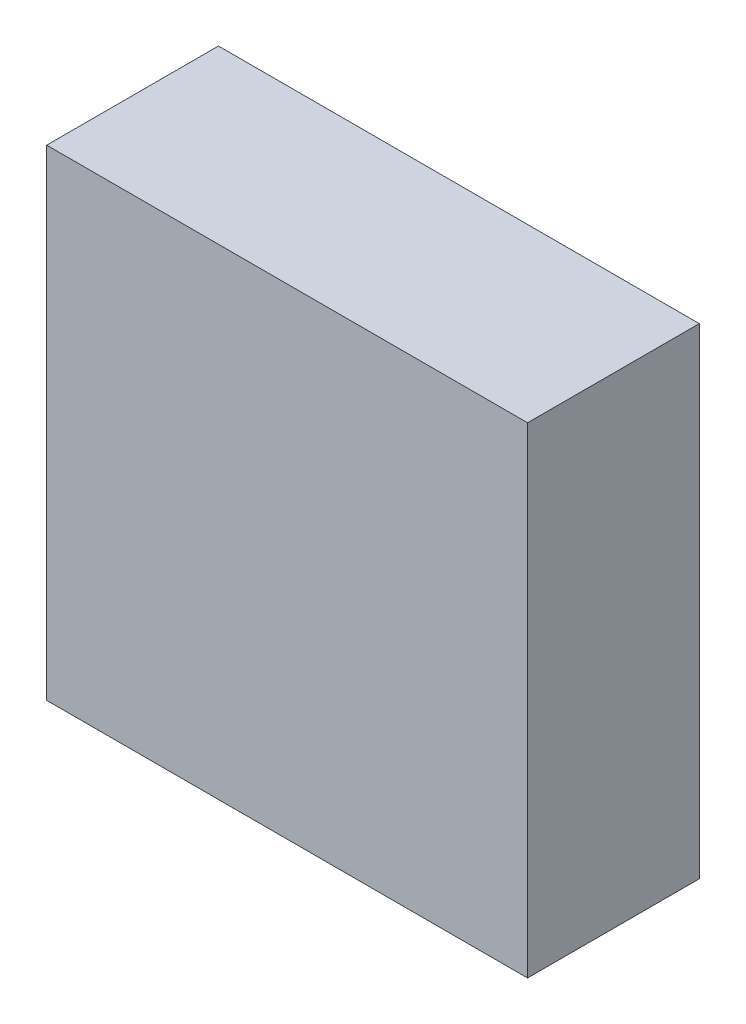
ISO-10303-21;
HEADER;
FILE_DESCRIPTION(('STEP AP214'),'2;1');
FILE_NAME('part.step','',(''),(''),'','','');
FILE_SCHEMA(('AUTOMOTIVE_DESIGN { 1 0 10303 214 1 1 1 1 }'));
ENDSEC;
DATA;
#1=APPLICATION_CONTEXT('core data for automotive mechanical design processes');
#2=APPLICATION_PROTOCOL_DEFINITION('international standard','automotive_design',2000,#1);
#3=PRODUCT_CONTEXT('',#1,'mechanical');
#4=PRODUCT('Part','Part','',(#3));
#5=PRODUCT_RELATED_PRODUCT_CATEGORY('part','',(#4));
#6=PRODUCT_DEFINITION_FORMATION('','',#4);
#7=PRODUCT_DEFINITION_CONTEXT('part definition',#1,'design');
#8=PRODUCT_DEFINITION('design','',#6,#7);
#9=PRODUCT_DEFINITION_SHAPE('','',#8);
#10=(LENGTH_UNIT() NAMED_UNIT(*) SI_UNIT(.MILLI.,.METRE.));
#11=(NAMED_UNIT(*) PLANE_ANGLE_UNIT() SI_UNIT($,.RADIAN.));
#12=(NAMED_UNIT(*) SI_UNIT($,.STERADIAN.) SOLID_ANGLE_UNIT());
#13=UNCERTAINTY_MEASURE_WITH_UNIT(LENGTH_MEASURE(1.E-05),#10,'distance_accuracy_value','');
#14=(GEOMETRIC_REPRESENTATION_CONTEXT(3) GLOBAL_UNCERTAINTY_ASSIGNED_CONTEXT((#13)) GLOBAL_UNIT_ASSIGNED_CONTEXT((#10,
#11,#12)) REPRESENTATION_CONTEXT('',''));
#15=CARTESIAN_POINT('',(0.,0.,0.));
#16=DIRECTION('',(0.,0.,1.));
#17=DIRECTION('',(1.,0.,0.));
#18=AXIS2_PLACEMENT_3D('',#15,#16,#17);
#19=CARTESIAN_POINT('',(-14.,-14.,-10.));
#20=DIRECTION('',(0.,-1.,0.));
#21=DIRECTION('',(0.,0.,-1.));
#22=AXIS2_PLACEMENT_3D('',#19,#20,#21);
#23=PLANE('',#22);
#24=DIRECTION('',(1.,0.,0.));
#25=VECTOR('',#24,1.);
#26=CARTESIAN_POINT('',(-14.,-14.,0.));
#27=LINE('',#26,#25);
#28=CARTESIAN_POINT('',(-14.,-14.,0.));
#29=VERTEX_POINT('',#28);
#30=CARTESIAN_POINT('',(14.,-14.,0.));
#31=VERTEX_POINT('',#30);
#32=EDGE_CURVE('E101',#29,#31,#27,.T.);
#33=ORIENTED_EDGE('',*,*,#32,.F.);
#34=DIRECTION('',(0.,0.,1.));
#35=VECTOR('',#34,1.);
#36=CARTESIAN_POINT('',(-14.,-14.,-10.));
#37=LINE('',#36,#35);
#38=CARTESIAN_POINT('',(-14.,-14.,-10.));
#39=VERTEX_POINT('',#38);
#40=EDGE_CURVE('E11',#39,#29,#37,.T.);
#41=ORIENTED_EDGE('',*,*,#40,.F.);
#42=DIRECTION('',(1.,0.,0.));
#43=VECTOR('',#42,1.);
#44=CARTESIAN_POINT('',(-14.,-14.,-10.));
#45=LINE('',#44,#43);
#46=CARTESIAN_POINT('',(14.,-14.,-10.));
#47=VERTEX_POINT('',#46);
#48=EDGE_CURVE('E95',#39,#47,#45,.T.);
#49=ORIENTED_EDGE('',*,*,#48,.T.);
#50=DIRECTION('',(0.,0.,1.));
#51=VECTOR('',#50,1.);
#52=CARTESIAN_POINT('',(14.,-14.,-10.));
#53=LINE('',#52,#51);
#54=EDGE_CURVE('E40',#47,#31,#53,.T.);
#55=ORIENTED_EDGE('',*,*,#54,.T.);
#56=EDGE_LOOP('',(#33,#41,#49,#55));
#57=FACE_BOUND('',#56,.T.);
#58=ADVANCED_FACE('F37',(#57),#23,.T.);
#59=CARTESIAN_POINT('',(-14.,14.,-10.));
#60=DIRECTION('',(-1.,0.,0.));
#61=DIRECTION('',(0.,-1.,0.));
#62=AXIS2_PLACEMENT_3D('',#59,#60,#61);
#63=PLANE('',#62);
#64=DIRECTION('',(0.,-1.,0.));
#65=VECTOR('',#64,1.);
#66=CARTESIAN_POINT('',(-14.,14.,0.));
#67=LINE('',#66,#65);
#68=CARTESIAN_POINT('',(-14.,14.,0.));
#69=VERTEX_POINT('',#68);
#70=EDGE_CURVE('E97',#69,#29,#67,.T.);
#71=ORIENTED_EDGE('',*,*,#70,.F.);
#72=DIRECTION('',(0.,0.,1.));
#73=VECTOR('',#72,1.);
#74=CARTESIAN_POINT('',(-14.,14.,-10.));
#75=LINE('',#74,#73);
#76=CARTESIAN_POINT('',(-14.,14.,-10.));
#77=VERTEX_POINT('',#76);
#78=EDGE_CURVE('E46',#77,#69,#75,.T.);
#79=ORIENTED_EDGE('',*,*,#78,.F.);
#80=DIRECTION('',(0.,-1.,0.));
#81=VECTOR('',#80,1.);
#82=CARTESIAN_POINT('',(-14.,14.,-10.));
#83=LINE('',#82,#81);
#84=EDGE_CURVE('E85',#77,#39,#83,.T.);
#85=ORIENTED_EDGE('',*,*,#84,.T.);
#86=ORIENTED_EDGE('',*,*,#40,.T.);
#87=EDGE_LOOP('',(#71,#79,#85,#86));
#88=FACE_BOUND('',#87,.T.);
#89=ADVANCED_FACE('F111',(#88),#63,.T.);
#90=CARTESIAN_POINT('',(-14.,14.,-10.));
#91=DIRECTION('',(0.,-1.,0.));
#92=DIRECTION('',(0.,0.,-1.));
#93=AXIS2_PLACEMENT_3D('',#90,#91,#92);
#94=PLANE('',#93);
#95=DIRECTION('',(1.,0.,0.));
#96=VECTOR('',#95,1.);
#97=CARTESIAN_POINT('',(-14.,14.,0.));
#98=LINE('',#97,#96);
#99=CARTESIAN_POINT('',(14.,14.,0.));
#100=VERTEX_POINT('',#99);
#101=EDGE_CURVE('E90',#69,#100,#98,.T.);
#102=ORIENTED_EDGE('',*,*,#101,.T.);
#103=DIRECTION('',(0.,0.,1.));
#104=VECTOR('',#103,1.);
#105=CARTESIAN_POINT('',(14.,14.,-10.));
#106=LINE('',#105,#104);
#107=CARTESIAN_POINT('',(14.,14.,-10.));
#108=VERTEX_POINT('',#107);
#109=EDGE_CURVE('E88',#108,#100,#106,.T.);
#110=ORIENTED_EDGE('',*,*,#109,.F.);
#111=DIRECTION('',(1.,0.,0.));
#112=VECTOR('',#111,1.);
#113=CARTESIAN_POINT('',(-14.,14.,-10.));
#114=LINE('',#113,#112);
#115=EDGE_CURVE('E82',#77,#108,#114,.T.);
#116=ORIENTED_EDGE('',*,*,#115,.F.);
#117=ORIENTED_EDGE('',*,*,#78,.T.);
#118=EDGE_LOOP('',(#102,#110,#116,#117));
#119=FACE_BOUND('',#118,.T.);
#120=ADVANCED_FACE('F89',(#119),#94,.F.);
#121=CARTESIAN_POINT('',(14.,14.,-10.));
#122=DIRECTION('',(-1.,0.,0.));
#123=DIRECTION('',(0.,0.,1.));
#124=AXIS2_PLACEMENT_3D('',#121,#122,#123);
#125=PLANE('',#124);
#126=DIRECTION('',(0.,-1.,0.));
#127=VECTOR('',#126,1.);
#128=CARTESIAN_POINT('',(14.,14.,0.));
#129=LINE('',#128,#127);
#130=EDGE_CURVE('E104',#100,#31,#129,.T.);
#131=ORIENTED_EDGE('',*,*,#130,.T.);
#132=ORIENTED_EDGE('',*,*,#54,.F.);
#133=DIRECTION('',(0.,-1.,0.));
#134=VECTOR('',#133,1.);
#135=CARTESIAN_POINT('',(14.,14.,-10.));
#136=LINE('',#135,#134);
#137=EDGE_CURVE('E79',#108,#47,#136,.T.);
#138=ORIENTED_EDGE('',*,*,#137,.F.);
#139=ORIENTED_EDGE('',*,*,#109,.T.);
#140=EDGE_LOOP('',(#131,#132,#138,#139));
#141=FACE_BOUND('',#140,.T.);
#142=ADVANCED_FACE('F94',(#141),#125,.F.);
#143=CARTESIAN_POINT('',(0.,0.,-10.));
#144=DIRECTION('',(0.,0.,-1.));
#145=DIRECTION('',(-1.,0.,0.));
#146=AXIS2_PLACEMENT_3D('',#143,#144,#145);
#147=PLANE('',#146);
#148=ORIENTED_EDGE('',*,*,#48,.F.);
#149=ORIENTED_EDGE('',*,*,#84,.F.);
#150=ORIENTED_EDGE('',*,*,#115,.T.);
#151=ORIENTED_EDGE('',*,*,#137,.T.);
#152=EDGE_LOOP('',(#148,#149,#150,#151));
#153=FACE_BOUND('',#152,.T.);
#154=ADVANCED_FACE('F84',(#153),#147,.T.);
#155=CARTESIAN_POINT('',(0.,0.,0.));
#156=DIRECTION('',(0.,0.,-1.));
#157=DIRECTION('',(-1.,0.,0.));
#158=AXIS2_PLACEMENT_3D('',#155,#156,#157);
#159=PLANE('',#158);
#160=ORIENTED_EDGE('',*,*,#32,.T.);
#161=ORIENTED_EDGE('',*,*,#130,.F.);
#162=ORIENTED_EDGE('',*,*,#101,.F.);
#163=ORIENTED_EDGE('',*,*,#70,.T.);
#164=EDGE_LOOP('',(#160,#161,#162,#163));
#165=FACE_BOUND('',#164,.T.);
#166=ADVANCED_FACE('F110',(#165),#159,.F.);
#167=CLOSED_SHELL('',(#58,#89,#120,#142,#154,#166));
#168=MANIFOLD_SOLID_BREP('B2',#167);
#169=ADVANCED_BREP_SHAPE_REPRESENTATION('',(#18,#168),#14);
#170=SHAPE_DEFINITION_REPRESENTATION(#9,#169);
ENDSEC;
END-ISO-10303-21;
